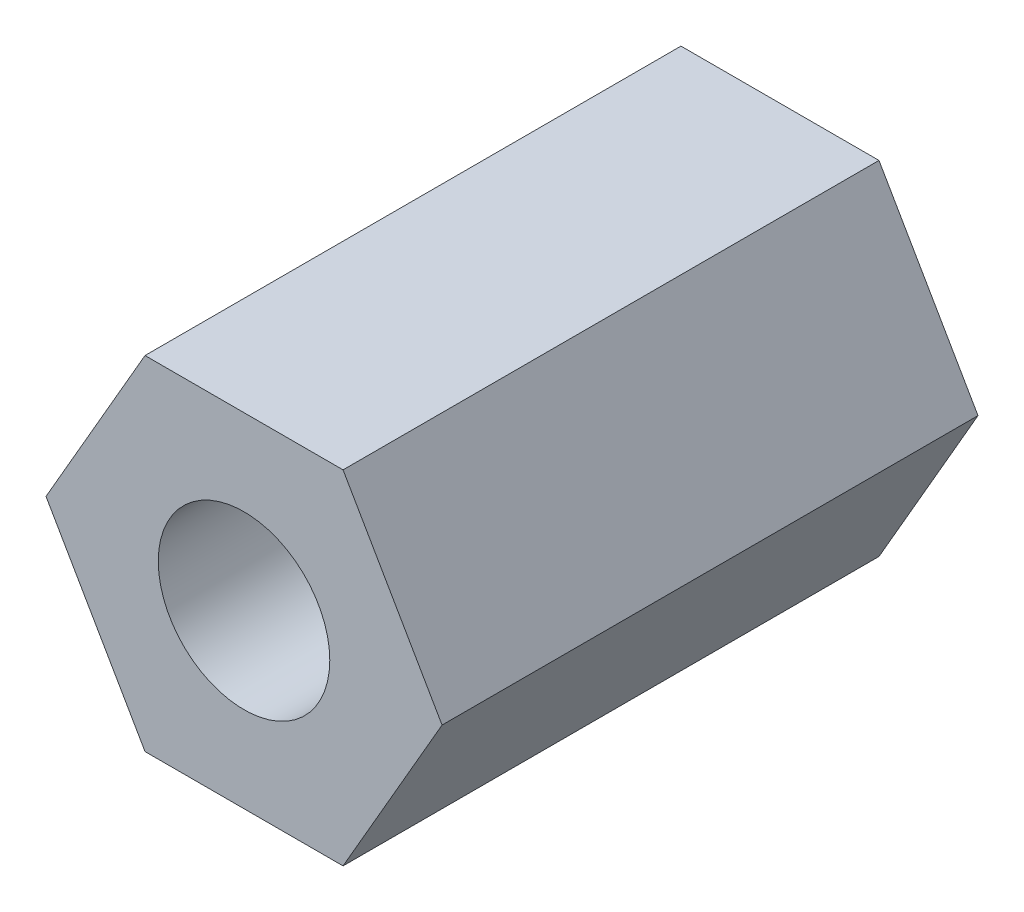
ISO-10303-21;
HEADER;
FILE_DESCRIPTION(('STEP AP214'),'2;1');
FILE_NAME('part.step','',(''),(''),'','','');
FILE_SCHEMA(('AUTOMOTIVE_DESIGN { 1 0 10303 214 1 1 1 1 }'));
ENDSEC;
DATA;
#1=APPLICATION_CONTEXT('core data for automotive mechanical design processes');
#2=APPLICATION_PROTOCOL_DEFINITION('international standard','automotive_design',2000,#1);
#3=PRODUCT_CONTEXT('',#1,'mechanical');
#4=PRODUCT('Part','Part','',(#3));
#5=PRODUCT_RELATED_PRODUCT_CATEGORY('part','',(#4));
#6=PRODUCT_DEFINITION_FORMATION('','',#4);
#7=PRODUCT_DEFINITION_CONTEXT('part definition',#1,'design');
#8=PRODUCT_DEFINITION('design','',#6,#7);
#9=PRODUCT_DEFINITION_SHAPE('','',#8);
#10=(LENGTH_UNIT() NAMED_UNIT(*) SI_UNIT(.MILLI.,.METRE.));
#11=(NAMED_UNIT(*) PLANE_ANGLE_UNIT() SI_UNIT($,.RADIAN.));
#12=(NAMED_UNIT(*) SI_UNIT($,.STERADIAN.) SOLID_ANGLE_UNIT());
#13=UNCERTAINTY_MEASURE_WITH_UNIT(LENGTH_MEASURE(1.E-05),#10,'distance_accuracy_value','');
#14=(GEOMETRIC_REPRESENTATION_CONTEXT(3) GLOBAL_UNCERTAINTY_ASSIGNED_CONTEXT((#13)) GLOBAL_UNIT_ASSIGNED_CONTEXT((#10,
#11,#12)) REPRESENTATION_CONTEXT('',''));
#15=CARTESIAN_POINT('',(0.,0.,0.));
#16=DIRECTION('',(0.,0.,1.));
#17=DIRECTION('',(1.,0.,0.));
#18=AXIS2_PLACEMENT_3D('',#15,#16,#17);
#19=CARTESIAN_POINT('',(-0.923760430703401,-1.6,5.));
#20=DIRECTION('',(0.,1.,0.));
#21=DIRECTION('',(-1.,0.,0.));
#22=AXIS2_PLACEMENT_3D('',#19,#20,#21);
#23=PLANE('',#22);
#24=DIRECTION('',(1.,0.,0.));
#25=VECTOR('',#24,1.);
#26=CARTESIAN_POINT('',(-0.923760430703401,-1.6,0.));
#27=LINE('',#26,#25);
#28=CARTESIAN_POINT('',(-0.923760430703401,-1.6,0.));
#29=VERTEX_POINT('',#28);
#30=CARTESIAN_POINT('',(0.923760430703402,-1.6,0.));
#31=VERTEX_POINT('',#30);
#32=EDGE_CURVE('E121',#29,#31,#27,.T.);
#33=ORIENTED_EDGE('',*,*,#32,.T.);
#34=DIRECTION('',(0.,0.,-1.));
#35=VECTOR('',#34,1.);
#36=CARTESIAN_POINT('',(0.923760430703402,-1.6,5.));
#37=LINE('',#36,#35);
#38=CARTESIAN_POINT('',(0.923760430703402,-1.6,5.));
#39=VERTEX_POINT('',#38);
#40=EDGE_CURVE('E11',#39,#31,#37,.T.);
#41=ORIENTED_EDGE('',*,*,#40,.F.);
#42=DIRECTION('',(1.,0.,0.));
#43=VECTOR('',#42,1.);
#44=CARTESIAN_POINT('',(-0.923760430703401,-1.6,5.));
#45=LINE('',#44,#43);
#46=CARTESIAN_POINT('',(-0.923760430703401,-1.6,5.));
#47=VERTEX_POINT('',#46);
#48=EDGE_CURVE('E132',#47,#39,#45,.T.);
#49=ORIENTED_EDGE('',*,*,#48,.F.);
#50=DIRECTION('',(0.,0.,-1.));
#51=VECTOR('',#50,1.);
#52=CARTESIAN_POINT('',(-0.923760430703401,-1.6,5.));
#53=LINE('',#52,#51);
#54=EDGE_CURVE('E117',#47,#29,#53,.T.);
#55=ORIENTED_EDGE('',*,*,#54,.T.);
#56=EDGE_LOOP('',(#33,#41,#49,#55));
#57=FACE_BOUND('',#56,.T.);
#58=ADVANCED_FACE('F37',(#57),#23,.F.);
#59=CARTESIAN_POINT('',(0.923760430703402,-1.6,5.));
#60=DIRECTION('',(-0.866025403784439,0.5,0.));
#61=DIRECTION('',(-0.5,-0.866025403784439,0.));
#62=AXIS2_PLACEMENT_3D('',#59,#60,#61);
#63=PLANE('',#62);
#64=DIRECTION('',(0.5,0.866025403784439,0.));
#65=VECTOR('',#64,1.);
#66=CARTESIAN_POINT('',(0.923760430703402,-1.6,0.));
#67=LINE('',#66,#65);
#68=CARTESIAN_POINT('',(1.8475208614068,0.,0.));
#69=VERTEX_POINT('',#68);
#70=EDGE_CURVE('E124',#31,#69,#67,.T.);
#71=ORIENTED_EDGE('',*,*,#70,.T.);
#72=DIRECTION('',(0.,0.,-1.));
#73=VECTOR('',#72,1.);
#74=CARTESIAN_POINT('',(1.8475208614068,0.,5.));
#75=LINE('',#74,#73);
#76=CARTESIAN_POINT('',(1.8475208614068,0.,5.));
#77=VERTEX_POINT('',#76);
#78=EDGE_CURVE('E45',#77,#69,#75,.T.);
#79=ORIENTED_EDGE('',*,*,#78,.F.);
#80=DIRECTION('',(0.5,0.866025403784439,0.));
#81=VECTOR('',#80,1.);
#82=CARTESIAN_POINT('',(0.923760430703402,-1.6,5.));
#83=LINE('',#82,#81);
#84=EDGE_CURVE('E90',#39,#77,#83,.T.);
#85=ORIENTED_EDGE('',*,*,#84,.F.);
#86=ORIENTED_EDGE('',*,*,#40,.T.);
#87=EDGE_LOOP('',(#71,#79,#85,#86));
#88=FACE_BOUND('',#87,.T.);
#89=ADVANCED_FACE('F157',(#88),#63,.F.);
#90=CARTESIAN_POINT('',(1.8475208614068,0.,5.));
#91=DIRECTION('',(-0.866025403784438,-0.5,0.));
#92=DIRECTION('',(0.5,-0.866025403784439,0.));
#93=AXIS2_PLACEMENT_3D('',#90,#91,#92);
#94=PLANE('',#93);
#95=DIRECTION('',(-0.5,0.866025403784439,0.));
#96=VECTOR('',#95,1.);
#97=CARTESIAN_POINT('',(1.8475208614068,0.,0.));
#98=LINE('',#97,#96);
#99=CARTESIAN_POINT('',(0.923760430703402,1.6,0.));
#100=VERTEX_POINT('',#99);
#101=EDGE_CURVE('E127',#69,#100,#98,.T.);
#102=ORIENTED_EDGE('',*,*,#101,.T.);
#103=DIRECTION('',(0.,0.,-1.));
#104=VECTOR('',#103,1.);
#105=CARTESIAN_POINT('',(0.923760430703402,1.6,5.));
#106=LINE('',#105,#104);
#107=CARTESIAN_POINT('',(0.923760430703402,1.6,5.));
#108=VERTEX_POINT('',#107);
#109=EDGE_CURVE('E112',#108,#100,#106,.T.);
#110=ORIENTED_EDGE('',*,*,#109,.F.);
#111=DIRECTION('',(-0.5,0.866025403784439,0.));
#112=VECTOR('',#111,1.);
#113=CARTESIAN_POINT('',(1.8475208614068,0.,5.));
#114=LINE('',#113,#112);
#115=EDGE_CURVE('E103',#77,#108,#114,.T.);
#116=ORIENTED_EDGE('',*,*,#115,.F.);
#117=ORIENTED_EDGE('',*,*,#78,.T.);
#118=EDGE_LOOP('',(#102,#110,#116,#117));
#119=FACE_BOUND('',#118,.T.);
#120=ADVANCED_FACE('F138',(#119),#94,.F.);
#121=CARTESIAN_POINT('',(0.923760430703402,1.6,5.));
#122=DIRECTION('',(0.,-1.,0.));
#123=DIRECTION('',(1.,0.,0.));
#124=AXIS2_PLACEMENT_3D('',#121,#122,#123);
#125=PLANE('',#124);
#126=DIRECTION('',(-1.,0.,0.));
#127=VECTOR('',#126,1.);
#128=CARTESIAN_POINT('',(0.923760430703402,1.6,0.));
#129=LINE('',#128,#127);
#130=CARTESIAN_POINT('',(-0.923760430703402,1.6,0.));
#131=VERTEX_POINT('',#130);
#132=EDGE_CURVE('E111',#100,#131,#129,.T.);
#133=ORIENTED_EDGE('',*,*,#132,.T.);
#134=DIRECTION('',(0.,0.,-1.));
#135=VECTOR('',#134,1.);
#136=CARTESIAN_POINT('',(-0.923760430703402,1.6,5.));
#137=LINE('',#136,#135);
#138=CARTESIAN_POINT('',(-0.923760430703402,1.6,5.));
#139=VERTEX_POINT('',#138);
#140=EDGE_CURVE('E108',#139,#131,#137,.T.);
#141=ORIENTED_EDGE('',*,*,#140,.F.);
#142=DIRECTION('',(-1.,0.,0.));
#143=VECTOR('',#142,1.);
#144=CARTESIAN_POINT('',(0.923760430703402,1.6,5.));
#145=LINE('',#144,#143);
#146=EDGE_CURVE('E97',#108,#139,#145,.T.);
#147=ORIENTED_EDGE('',*,*,#146,.F.);
#148=ORIENTED_EDGE('',*,*,#109,.T.);
#149=EDGE_LOOP('',(#133,#141,#147,#148));
#150=FACE_BOUND('',#149,.T.);
#151=ADVANCED_FACE('F109',(#150),#125,.F.);
#152=CARTESIAN_POINT('',(-0.923760430703402,1.6,5.));
#153=DIRECTION('',(0.866025403784439,-0.5,0.));
#154=DIRECTION('',(0.5,0.866025403784439,0.));
#155=AXIS2_PLACEMENT_3D('',#152,#153,#154);
#156=PLANE('',#155);
#157=DIRECTION('',(-0.5,-0.866025403784439,0.));
#158=VECTOR('',#157,1.);
#159=CARTESIAN_POINT('',(-0.923760430703402,1.6,0.));
#160=LINE('',#159,#158);
#161=CARTESIAN_POINT('',(-1.8475208614068,0.,0.));
#162=VERTEX_POINT('',#161);
#163=EDGE_CURVE('E76',#131,#162,#160,.T.);
#164=ORIENTED_EDGE('',*,*,#163,.T.);
#165=DIRECTION('',(0.,0.,-1.));
#166=VECTOR('',#165,1.);
#167=CARTESIAN_POINT('',(-1.8475208614068,0.,5.));
#168=LINE('',#167,#166);
#169=CARTESIAN_POINT('',(-1.8475208614068,0.,5.));
#170=VERTEX_POINT('',#169);
#171=EDGE_CURVE('E113',#170,#162,#168,.T.);
#172=ORIENTED_EDGE('',*,*,#171,.F.);
#173=DIRECTION('',(-0.5,-0.866025403784439,0.));
#174=VECTOR('',#173,1.);
#175=CARTESIAN_POINT('',(-0.923760430703402,1.6,5.));
#176=LINE('',#175,#174);
#177=EDGE_CURVE('E101',#139,#170,#176,.T.);
#178=ORIENTED_EDGE('',*,*,#177,.F.);
#179=ORIENTED_EDGE('',*,*,#140,.T.);
#180=EDGE_LOOP('',(#164,#172,#178,#179));
#181=FACE_BOUND('',#180,.T.);
#182=ADVANCED_FACE('F115',(#181),#156,.F.);
#183=CARTESIAN_POINT('',(-1.8475208614068,0.,5.));
#184=DIRECTION('',(0.866025403784439,0.5,0.));
#185=DIRECTION('',(-0.5,0.866025403784439,0.));
#186=AXIS2_PLACEMENT_3D('',#183,#184,#185);
#187=PLANE('',#186);
#188=DIRECTION('',(0.5,-0.866025403784439,0.));
#189=VECTOR('',#188,1.);
#190=CARTESIAN_POINT('',(-1.8475208614068,0.,0.));
#191=LINE('',#190,#189);
#192=EDGE_CURVE('E82',#162,#29,#191,.T.);
#193=ORIENTED_EDGE('',*,*,#192,.T.);
#194=ORIENTED_EDGE('',*,*,#54,.F.);
#195=DIRECTION('',(0.5,-0.866025403784439,0.));
#196=VECTOR('',#195,1.);
#197=CARTESIAN_POINT('',(-1.8475208614068,0.,5.));
#198=LINE('',#197,#196);
#199=EDGE_CURVE('E53',#170,#47,#198,.T.);
#200=ORIENTED_EDGE('',*,*,#199,.F.);
#201=ORIENTED_EDGE('',*,*,#171,.T.);
#202=EDGE_LOOP('',(#193,#194,#200,#201));
#203=FACE_BOUND('',#202,.T.);
#204=ADVANCED_FACE('F145',(#203),#187,.F.);
#205=CARTESIAN_POINT('',(-2.7712812921102,-1.6,5.));
#206=DIRECTION('',(0.,0.,-1.));
#207=DIRECTION('',(-1.,0.,0.));
#208=AXIS2_PLACEMENT_3D('',#205,#206,#207);
#209=PLANE('',#208);
#210=CARTESIAN_POINT('',(0.,0.,5.));
#211=DIRECTION('',(0.,0.,-1.));
#212=DIRECTION('',(-1.,0.,0.));
#213=AXIS2_PLACEMENT_3D('',#210,#211,#212);
#214=CIRCLE('',#213,0.799999999999999);
#215=CARTESIAN_POINT('',(-0.799999999999999,0.,5.));
#216=VERTEX_POINT('',#215);
#217=EDGE_CURVE('E125',#216,#216,#214,.T.);
#218=ORIENTED_EDGE('',*,*,#217,.T.);
#219=EDGE_LOOP('',(#218));
#220=FACE_BOUND('',#219,.T.);
#221=ORIENTED_EDGE('',*,*,#48,.T.);
#222=ORIENTED_EDGE('',*,*,#84,.T.);
#223=ORIENTED_EDGE('',*,*,#115,.T.);
#224=ORIENTED_EDGE('',*,*,#146,.T.);
#225=ORIENTED_EDGE('',*,*,#177,.T.);
#226=ORIENTED_EDGE('',*,*,#199,.T.);
#227=EDGE_LOOP('',(#221,#222,#223,#224,#225,#226));
#228=FACE_BOUND('',#227,.T.);
#229=ADVANCED_FACE('F99',(#220,#228),#209,.F.);
#230=CARTESIAN_POINT('',(-2.7712812921102,-1.6,0.));
#231=DIRECTION('',(0.,0.,-1.));
#232=DIRECTION('',(-1.,0.,0.));
#233=AXIS2_PLACEMENT_3D('',#230,#231,#232);
#234=PLANE('',#233);
#235=CARTESIAN_POINT('',(0.,0.,0.));
#236=DIRECTION('',(0.,0.,-1.));
#237=DIRECTION('',(-1.,0.,0.));
#238=AXIS2_PLACEMENT_3D('',#235,#236,#237);
#239=CIRCLE('',#238,0.799999999999999);
#240=CARTESIAN_POINT('',(-0.799999999999999,0.,0.));
#241=VERTEX_POINT('',#240);
#242=EDGE_CURVE('E214',#241,#241,#239,.T.);
#243=ORIENTED_EDGE('',*,*,#242,.F.);
#244=EDGE_LOOP('',(#243));
#245=FACE_BOUND('',#244,.T.);
#246=ORIENTED_EDGE('',*,*,#32,.F.);
#247=ORIENTED_EDGE('',*,*,#192,.F.);
#248=ORIENTED_EDGE('',*,*,#163,.F.);
#249=ORIENTED_EDGE('',*,*,#132,.F.);
#250=ORIENTED_EDGE('',*,*,#101,.F.);
#251=ORIENTED_EDGE('',*,*,#70,.F.);
#252=EDGE_LOOP('',(#246,#247,#248,#249,#250,#251));
#253=FACE_BOUND('',#252,.T.);
#254=ADVANCED_FACE('F141',(#245,#253),#234,.T.);
#255=CARTESIAN_POINT('',(0.,0.,0.));
#256=DIRECTION('',(0.,0.,-1.));
#257=DIRECTION('',(-1.,0.,0.));
#258=AXIS2_PLACEMENT_3D('',#255,#256,#257);
#259=CYLINDRICAL_SURFACE('',#258,0.799999999999999);
#260=ORIENTED_EDGE('',*,*,#242,.T.);
#261=EDGE_LOOP('',(#260));
#262=FACE_BOUND('',#261,.T.);
#263=ORIENTED_EDGE('',*,*,#217,.F.);
#264=EDGE_LOOP('',(#263));
#265=FACE_BOUND('',#264,.T.);
#266=ADVANCED_FACE('F194',(#262,#265),#259,.F.);
#267=CLOSED_SHELL('',(#58,#89,#120,#151,#182,#204,#229,#254,#266));
#268=MANIFOLD_SOLID_BREP('B2',#267);
#269=ADVANCED_BREP_SHAPE_REPRESENTATION('',(#18,#268),#14);
#270=SHAPE_DEFINITION_REPRESENTATION(#9,#269);
ENDSEC;
END-ISO-10303-21;
